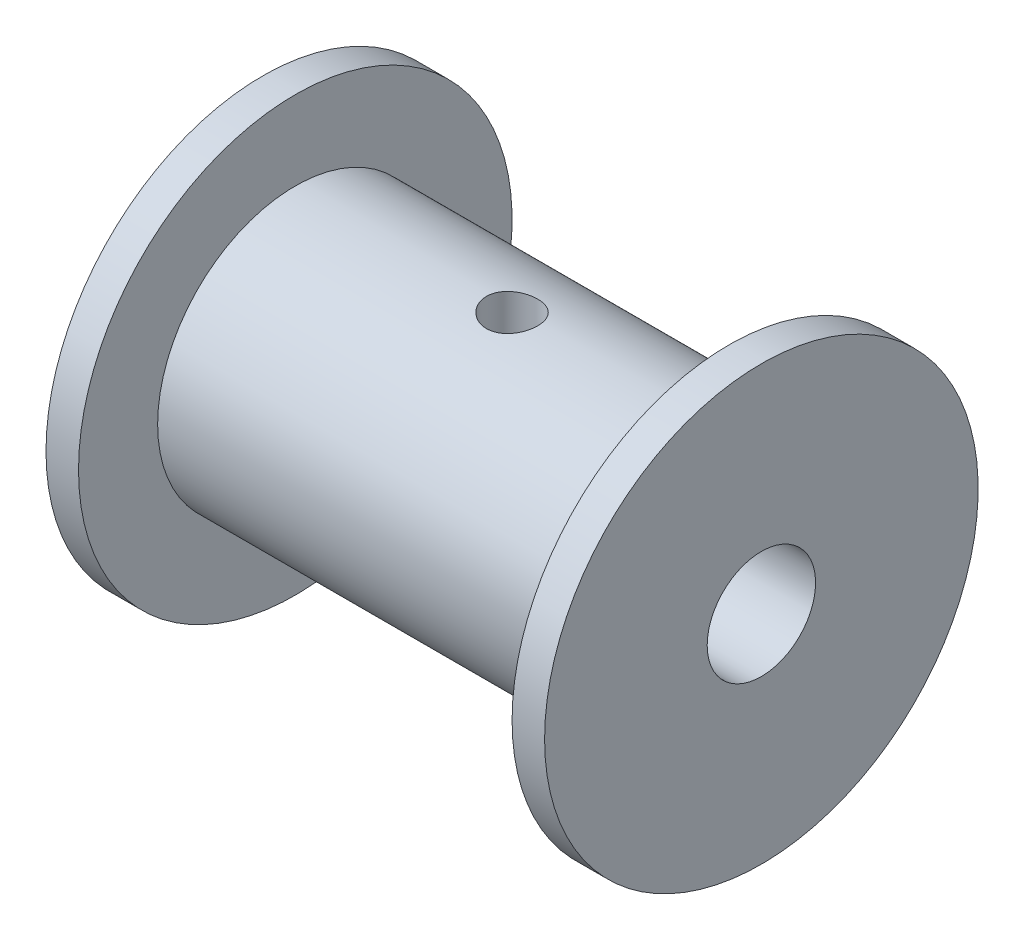
ISO-10303-21;
HEADER;
FILE_DESCRIPTION(('STEP AP214'),'2;1');
FILE_NAME('part.step','',(''),(''),'','','');
FILE_SCHEMA(('AUTOMOTIVE_DESIGN { 1 0 10303 214 1 1 1 1 }'));
ENDSEC;
DATA;
#1=APPLICATION_CONTEXT('core data for automotive mechanical design processes');
#2=APPLICATION_PROTOCOL_DEFINITION('international standard','automotive_design',2000,#1);
#3=PRODUCT_CONTEXT('',#1,'mechanical');
#4=PRODUCT('Part','Part','',(#3));
#5=PRODUCT_RELATED_PRODUCT_CATEGORY('part','',(#4));
#6=PRODUCT_DEFINITION_FORMATION('','',#4);
#7=PRODUCT_DEFINITION_CONTEXT('part definition',#1,'design');
#8=PRODUCT_DEFINITION('design','',#6,#7);
#9=PRODUCT_DEFINITION_SHAPE('','',#8);
#10=(LENGTH_UNIT() NAMED_UNIT(*) SI_UNIT(.MILLI.,.METRE.));
#11=(NAMED_UNIT(*) PLANE_ANGLE_UNIT() SI_UNIT($,.RADIAN.));
#12=(NAMED_UNIT(*) SI_UNIT($,.STERADIAN.) SOLID_ANGLE_UNIT());
#13=UNCERTAINTY_MEASURE_WITH_UNIT(LENGTH_MEASURE(1.E-05),#10,'distance_accuracy_value','');
#14=(GEOMETRIC_REPRESENTATION_CONTEXT(3) GLOBAL_UNCERTAINTY_ASSIGNED_CONTEXT((#13)) GLOBAL_UNIT_ASSIGNED_CONTEXT((#10,
#11,#12)) REPRESENTATION_CONTEXT('',''));
#15=CARTESIAN_POINT('',(0.,0.,0.));
#16=DIRECTION('',(0.,0.,1.));
#17=DIRECTION('',(1.,0.,0.));
#18=AXIS2_PLACEMENT_3D('',#15,#16,#17);
#19=CARTESIAN_POINT('',(-15.2755244755245,0.,0.));
#20=DIRECTION('',(-1.,0.,0.));
#21=DIRECTION('',(0.,0.,1.));
#22=AXIS2_PLACEMENT_3D('',#19,#20,#21);
#23=CYLINDRICAL_SURFACE('',#22,3.175);
#24=CARTESIAN_POINT('',(14.605,0.,0.));
#25=DIRECTION('',(-1.,0.,0.));
#26=DIRECTION('',(0.,0.,1.));
#27=AXIS2_PLACEMENT_3D('',#24,#25,#26);
#28=CIRCLE('',#27,3.175);
#29=CARTESIAN_POINT('',(14.605,0.,3.175));
#30=VERTEX_POINT('',#29);
#31=EDGE_CURVE('E76',#30,#30,#28,.T.);
#32=ORIENTED_EDGE('',*,*,#31,.F.);
#33=EDGE_LOOP('',(#32));
#34=FACE_BOUND('',#33,.T.);
#35=CARTESIAN_POINT('',(-14.605,0.,0.));
#36=DIRECTION('',(-1.,0.,0.));
#37=DIRECTION('',(0.,0.,1.));
#38=AXIS2_PLACEMENT_3D('',#35,#36,#37);
#39=CIRCLE('',#38,3.175);
#40=CARTESIAN_POINT('',(-14.605,0.,3.175));
#41=VERTEX_POINT('',#40);
#42=EDGE_CURVE('E70',#41,#41,#39,.T.);
#43=ORIENTED_EDGE('',*,*,#42,.T.);
#44=EDGE_LOOP('',(#43));
#45=FACE_BOUND('',#44,.T.);
#46=CARTESIAN_POINT('',(0.,2.7983253920872,-1.5));
#47=CARTESIAN_POINT('',(0.0788107476010317,2.79833097649977,-1.49999523547047));
#48=CARTESIAN_POINT('',(0.157735612205732,2.80170427159323,-1.49374832449328));
#49=CARTESIAN_POINT('',(0.313214667514685,2.81472644561665,-1.4690554061353));
#50=CARTESIAN_POINT('',(0.389762907162894,2.82438992585351,-1.45058101361493));
#51=CARTESIAN_POINT('',(0.537952673756733,2.84863009396432,-1.40237253355636));
#52=CARTESIAN_POINT('',(0.609616136431819,2.86318279906116,-1.37269332197988));
#53=CARTESIAN_POINT('',(0.74692939284759,2.89552502377023,-1.30308399064543));
#54=CARTESIAN_POINT('',(0.8125794422789,2.91331440566267,-1.26315430701281));
#55=CARTESIAN_POINT('',(0.941323245258398,2.95172227722859,-1.1707430871524));
#56=CARTESIAN_POINT('',(1.00387788849068,2.97245254188493,-1.11755658650795));
#57=CARTESIAN_POINT('',(1.11959143684936,3.01349951044786,-1.00161259672222));
#58=CARTESIAN_POINT('',(1.17274606260041,3.03381602228766,-0.938850772491945));
#59=CARTESIAN_POINT('',(1.27118937954777,3.07317288716969,-0.801034900704515));
#60=CARTESIAN_POINT('',(1.31583450125175,3.09206866660246,-0.725476017233364));
#61=CARTESIAN_POINT('',(1.39153752206176,3.12503381595021,-0.566861686619154));
#62=CARTESIAN_POINT('',(1.42260309774527,3.13910591174128,-0.483810507023549));
#63=CARTESIAN_POINT('',(1.46819431985617,3.16003750546179,-0.318263833167133));
#64=CARTESIAN_POINT('',(1.4836598006004,3.16730464125021,-0.23607983759682));
#65=CARTESIAN_POINT('',(1.50068669846295,3.17531500926786,-0.0699854874354078));
#66=CARTESIAN_POINT('',(1.50225551712034,3.17606171435844,0.0139239243031286));
#67=CARTESIAN_POINT('',(1.49185310738046,3.1711569999128,0.17410404695592));
#68=CARTESIAN_POINT('',(1.4809263684281,3.16599910390162,0.250460926307549));
#69=CARTESIAN_POINT('',(1.44768451199486,3.15058713309443,0.400106757592313));
#70=CARTESIAN_POINT('',(1.42536854800002,3.14033267949386,0.473395481043944));
#71=CARTESIAN_POINT('',(1.36978180811971,3.11549383971164,0.61616215999247));
#72=CARTESIAN_POINT('',(1.33635400002596,3.10084769916082,0.685567785451937));
#73=CARTESIAN_POINT('',(1.25968096352203,3.06858481389696,0.817962218284119));
#74=CARTESIAN_POINT('',(1.21643213988174,3.05096698193041,0.880948663490016));
#75=CARTESIAN_POINT('',(1.11701776567009,3.01265189942243,1.00453666893054));
#76=CARTESIAN_POINT('',(1.06005736803148,2.9918200943109,1.0644578414785));
#77=CARTESIAN_POINT('',(0.93699705964444,2.95046283361779,1.17424124933889));
#78=CARTESIAN_POINT('',(0.87089145595116,2.92993757775203,1.2240971710571));
#79=CARTESIAN_POINT('',(0.727172138151077,2.89039711066438,1.31484174230845));
#80=CARTESIAN_POINT('',(0.649138941996297,2.87151577260243,1.35512986365461));
#81=CARTESIAN_POINT('',(0.486283743531031,2.83914834140001,1.42170562946273));
#82=CARTESIAN_POINT('',(0.401468219875632,2.82565717160027,1.44800645544408));
#83=CARTESIAN_POINT('',(0.234253704737598,2.80697974613979,1.48387059914899));
#84=CARTESIAN_POINT('',(0.152157558069844,2.80124227464673,1.4945499135996));
#85=CARTESIAN_POINT('',(-0.0128364544628812,2.79714234532468,1.50221328025957));
#86=CARTESIAN_POINT('',(-0.0957338532268694,2.79877582206013,1.49920488189903));
#87=CARTESIAN_POINT('',(-0.25184110118071,2.80865284380239,1.4806017347564));
#88=CARTESIAN_POINT('',(-0.32523813353968,2.81627144126264,1.46619608896935));
#89=CARTESIAN_POINT('',(-0.468463633051388,2.83637948512089,1.42690562153975));
#90=CARTESIAN_POINT('',(-0.538291075738513,2.8488703210638,1.40201781025962));
#91=CARTESIAN_POINT('',(-0.676035807524976,2.87800314814948,1.3412324594274));
#92=CARTESIAN_POINT('',(-0.743715994140066,2.89481019393091,1.30487958898417));
#93=CARTESIAN_POINT('',(-0.872389828600745,2.93050507850425,1.22260967416881));
#94=CARTESIAN_POINT('',(-0.93338011780599,2.94939395301752,1.17668785898318));
#95=CARTESIAN_POINT('',(-1.05395122429284,2.98962533435876,1.07066250220429));
#96=CARTESIAN_POINT('',(-1.11263900919066,3.0110091844446,1.00955462247668));
#97=CARTESIAN_POINT('',(-1.2191662131219,3.05197816465585,0.877952835832725));
#98=CARTESIAN_POINT('',(-1.26700313884629,3.07156288076261,0.807456777596013));
#99=CARTESIAN_POINT('',(-1.35106340432696,3.10717258491727,0.657374049291596));
#100=CARTESIAN_POINT('',(-1.38708244177874,3.12313361565429,0.577656753882327));
#101=CARTESIAN_POINT('',(-1.44486593502356,3.14922093597641,0.412327293299583));
#102=CARTESIAN_POINT('',(-1.46664154231209,3.15935178938716,0.326719797872878));
#103=CARTESIAN_POINT('',(-1.49363889435459,3.17197971044583,0.159896332874223));
#104=CARTESIAN_POINT('',(-1.50011013632642,3.17505233840112,0.078925398284078));
#105=CARTESIAN_POINT('',(-1.49988711965684,3.17494636529876,-0.0829833461657175));
#106=CARTESIAN_POINT('',(-1.49319653511093,3.17176950877122,-0.163921158963004));
#107=CARTESIAN_POINT('',(-1.46770848023088,3.15985410378094,-0.318841842835547));
#108=CARTESIAN_POINT('',(-1.44959197491994,3.15142868675494,-0.392963167600614));
#109=CARTESIAN_POINT('',(-1.40262108547478,3.13010132928976,-0.537026434022491));
#110=CARTESIAN_POINT('',(-1.37376499240882,3.1171986764347,-0.60696770847403));
#111=CARTESIAN_POINT('',(-1.30473490189286,3.08738510301285,-0.744198443618439));
#112=CARTESIAN_POINT('',(-1.26410939390821,3.0703197298679,-0.811226286131094));
#113=CARTESIAN_POINT('',(-1.17328432091972,3.03405477724481,-0.937805412907553));
#114=CARTESIAN_POINT('',(-1.12308040855481,3.01485423033003,-0.997353281796323));
#115=CARTESIAN_POINT('',(-1.00928446778082,2.97425749382228,-1.11287613406119));
#116=CARTESIAN_POINT('',(-0.944896373173603,2.9528185885393,-1.16805442942683));
#117=CARTESIAN_POINT('',(-0.807312145748489,2.91171333700677,-1.26705651381277));
#118=CARTESIAN_POINT('',(-0.734109598744511,2.89204830000693,-1.31087196019013));
#119=CARTESIAN_POINT('',(-0.579232422210802,2.85663554941127,-1.3863737982034));
#120=CARTESIAN_POINT('',(-0.497439352525226,2.84095675906997,-1.41785130272302));
#121=CARTESIAN_POINT('',(-0.328811998329219,2.81635628214136,-1.4661232120466));
#122=CARTESIAN_POINT('',(-0.241995696672077,2.80741192483264,-1.48296690968124));
#123=CARTESIAN_POINT('',(-0.128694633247988,2.80116429672363,-1.49469268672873));
#124=CARTESIAN_POINT('',(-0.10301180774758,2.80010260103933,-1.49668048940514));
#125=CARTESIAN_POINT('',(-0.0515567295081782,2.79868221732461,-1.49933495903092));
#126=CARTESIAN_POINT('',(-0.0257844722890938,2.79832356503778,-1.50000155880871));
#127=CARTESIAN_POINT('',(0.,2.7983253920872,-1.5));
#128=B_SPLINE_CURVE_WITH_KNOTS('',3,(#46,#47,#48,#49,#50,#51,#52,#53,#54,#55,#56,#57,#58,#59,
#60,#61,#62,#63,#64,#65,#66,#67,#68,#69,#70,#71,#72,#73,#74,#75,#76,#77,#78,#79,#80,#81,#82,#83,
#84,#85,#86,#87,#88,#89,#90,#91,#92,#93,#94,#95,#96,#97,#98,#99,#100,#101,#102,#103,#104,#105,
#106,#107,#108,#109,#110,#111,#112,#113,#114,#115,#116,#117,#118,#119,#120,#121,#122,#123,#124,
#125,#126,#127),.UNSPECIFIED.,.T.,.F.,(4,2,2,2,2,2,2,2,2,2,2,2,2,2,2,2,2,2,2,2,2,2,2,2,2,2,2,2,
2,2,2,2,2,2,2,2,2,2,2,2,4),(0.,0.236323871838544,0.473198284289302,0.708927337380699,
0.944646362603916,1.19762429635865,1.45071710395354,1.71864285343498,1.98641694681215,
2.23687152724756,2.48719270436037,2.71802817018661,2.94888079555674,3.1831453100556,
3.41749572162706,3.67216706074964,3.92699765369087,4.19506898546716,4.46288723920479,
4.71043828617548,4.95785281342715,5.18239796950746,5.40700721193729,5.64198832122139,
5.87708686716682,6.13804637958085,6.39906579463174,6.66438519401193,6.92949661955738,
7.17207877892644,7.41459323161728,7.64386670961211,7.87317668624822,8.11282240294707,
8.35257714778319,8.61378861881715,8.87519133270404,9.14084608292566,9.40560248746477,
9.48291651801969,9.56023447921351),.UNSPECIFIED.);
#129=CARTESIAN_POINT('',(0.,2.7983253920872,-1.5));
#130=VERTEX_POINT('',#129);
#131=EDGE_CURVE('E96',#130,#130,#128,.T.);
#132=ORIENTED_EDGE('',*,*,#131,.F.);
#133=EDGE_LOOP('',(#132));
#134=FACE_BOUND('',#133,.T.);
#135=ADVANCED_FACE('F51',(#34,#45,#134),#23,.F.);
#136=CARTESIAN_POINT('',(-15.2755244755245,0.,0.));
#137=DIRECTION('',(-1.,0.,0.));
#138=DIRECTION('',(0.,0.,1.));
#139=AXIS2_PLACEMENT_3D('',#136,#137,#138);
#140=CYLINDRICAL_SURFACE('',#139,8.0645);
#141=CARTESIAN_POINT('',(-12.7,0.,0.));
#142=DIRECTION('',(-1.,0.,0.));
#143=DIRECTION('',(0.,0.,1.));
#144=AXIS2_PLACEMENT_3D('',#141,#142,#143);
#145=CIRCLE('',#144,8.0645);
#146=CARTESIAN_POINT('',(-12.7,0.,8.0645));
#147=VERTEX_POINT('',#146);
#148=EDGE_CURVE('E92',#147,#147,#145,.T.);
#149=ORIENTED_EDGE('',*,*,#148,.F.);
#150=EDGE_LOOP('',(#149));
#151=FACE_BOUND('',#150,.T.);
#152=CARTESIAN_POINT('',(12.7,0.,0.));
#153=DIRECTION('',(-1.,0.,0.));
#154=DIRECTION('',(0.,0.,1.));
#155=AXIS2_PLACEMENT_3D('',#152,#153,#154);
#156=CIRCLE('',#155,8.0645);
#157=CARTESIAN_POINT('',(12.7,0.,8.0645));
#158=VERTEX_POINT('',#157);
#159=EDGE_CURVE('E88',#158,#158,#156,.T.);
#160=ORIENTED_EDGE('',*,*,#159,.T.);
#161=EDGE_LOOP('',(#160));
#162=FACE_BOUND('',#161,.T.);
#163=CARTESIAN_POINT('',(0.,7.92377184489811,-1.5));
#164=CARTESIAN_POINT('',(0.08346999225124,7.9237734538727,-1.49999678574282));
#165=CARTESIAN_POINT('',(0.166981831122598,7.92510509008183,-1.49300912525413));
#166=CARTESIAN_POINT('',(0.331651557475362,7.93028125737973,-1.465261443805));
#167=CARTESIAN_POINT('',(0.412807373113565,7.93412793417546,-1.44448966269515));
#168=CARTESIAN_POINT('',(0.570358559424111,7.94388378807498,-1.38983296497414));
#169=CARTESIAN_POINT('',(0.646758254354492,7.94979105843547,-1.35596016807497));
#170=CARTESIAN_POINT('',(0.792785415471453,7.96300024226805,-1.27609492678907));
#171=CARTESIAN_POINT('',(0.862413427047705,7.97030204328437,-1.23010345954554));
#172=CARTESIAN_POINT('',(0.993779031686728,7.9855774618328,-1.12670590430802));
#173=CARTESIAN_POINT('',(1.05542163619568,7.99355757328761,-1.06918007561075));
#174=CARTESIAN_POINT('',(1.16823920190923,8.00923307476703,-0.944605532926529));
#175=CARTESIAN_POINT('',(1.21941348113181,8.0169284462149,-0.877556198991764));
#176=CARTESIAN_POINT('',(1.31020518495352,8.03123691251547,-0.735214641520338));
#177=CARTESIAN_POINT('',(1.34973313564861,8.03784146530635,-0.659864415440112));
#178=CARTESIAN_POINT('',(1.4155337793492,8.04915148284183,-0.503449338053651));
#179=CARTESIAN_POINT('',(1.44180754476066,8.05385710122446,-0.422384949689611));
#180=CARTESIAN_POINT('',(1.48006051144278,8.06079318837119,-0.257826787619601));
#181=CARTESIAN_POINT('',(1.49219980479087,8.06305135714503,-0.17437141552242));
#182=CARTESIAN_POINT('',(1.50233798434993,8.06493356258085,-0.00658004096476443));
#183=CARTESIAN_POINT('',(1.50033805628244,8.06455782012384,0.0777558870596309));
#184=CARTESIAN_POINT('',(1.48237749981114,8.06123620703969,0.243816740076963));
#185=CARTESIAN_POINT('',(1.46658924418254,8.05832207093516,0.325561034707383));
#186=CARTESIAN_POINT('',(1.42177273443912,8.0502866809281,0.485219503116541));
#187=CARTESIAN_POINT('',(1.39274400350547,8.04516534753988,0.563133538847228));
#188=CARTESIAN_POINT('',(1.32210579017994,8.03323788244329,0.713420735826199));
#189=CARTESIAN_POINT('',(1.28042724204538,8.02642253969638,0.785760673814137));
#190=CARTESIAN_POINT('',(1.18572336277713,8.01186102833994,0.922484388999932));
#191=CARTESIAN_POINT('',(1.13269689542425,8.0041147665555,0.986867368482127));
#192=CARTESIAN_POINT('',(1.01585206439317,7.98841171039542,1.10687065677505));
#193=CARTESIAN_POINT('',(0.951882907557722,7.98045350301508,1.16234405539621));
#194=CARTESIAN_POINT('',(0.815471301144276,7.9653353424318,1.26179684417697));
#195=CARTESIAN_POINT('',(0.743028731474736,7.95817540054528,1.305776071404));
#196=CARTESIAN_POINT('',(0.591533745322313,7.94546248569133,1.38103300471357));
#197=CARTESIAN_POINT('',(0.512470622228837,7.93991218309828,1.41228963841603));
#198=CARTESIAN_POINT('',(0.350088670254136,7.93108808617898,1.4610344761526));
#199=CARTESIAN_POINT('',(0.266770316402928,7.92781403833817,1.47852421348346));
#200=CARTESIAN_POINT('',(0.0995669829767135,7.92396322573631,1.49902487149708));
#201=CARTESIAN_POINT('',(0.0157087450574842,7.92334716793076,1.50224673307501));
#202=CARTESIAN_POINT('',(-0.151347559590066,7.92477697685847,1.49468538361545));
#203=CARTESIAN_POINT('',(-0.234545658220193,7.92682271416013,1.483902853551));
#204=CARTESIAN_POINT('',(-0.397228289082271,7.93330903129933,1.44881979239892));
#205=CARTESIAN_POINT('',(-0.47673746609808,7.93773005454083,1.42462960075962));
#206=CARTESIAN_POINT('',(-0.630574117098847,7.94845198992675,1.36353485958083));
#207=CARTESIAN_POINT('',(-0.704901214021849,7.95475303869108,1.326629386002));
#208=CARTESIAN_POINT('',(-0.847193844268481,7.96861467250661,1.24066526318392));
#209=CARTESIAN_POINT('',(-0.91507744549458,7.97618876284377,1.19147321412237));
#210=CARTESIAN_POINT('',(-1.04170287148394,7.99170496834265,1.08251244794541));
#211=CARTESIAN_POINT('',(-1.10044388710728,7.99964711599767,1.02274279568696));
#212=CARTESIAN_POINT('',(-1.20790342225976,8.0151306730024,0.893381906591112));
#213=CARTESIAN_POINT('',(-1.25648016441083,8.02266544854635,0.82367197704104));
#214=CARTESIAN_POINT('',(-1.34123220332478,8.03637407902485,0.676958042179703));
#215=CARTESIAN_POINT('',(-1.37740797217621,8.04254798576267,0.59995431467609));
#216=CARTESIAN_POINT('',(-1.43611829159826,8.05281069508312,0.441232587109995));
#217=CARTESIAN_POINT('',(-1.45872281202498,8.05691017535419,0.359541189147433));
#218=CARTESIAN_POINT('',(-1.4898724387586,8.06260765100307,0.193438057656404));
#219=CARTESIAN_POINT('',(-1.49841899979037,8.0642059052082,0.109026606522252));
#220=CARTESIAN_POINT('',(-1.50116011764579,8.06471581480838,-0.0587601988743187));
#221=CARTESIAN_POINT('',(-1.49556892499499,8.06366757682714,-0.142132006832127));
#222=CARTESIAN_POINT('',(-1.47066205121671,8.05908551327764,-0.306726317994638));
#223=CARTESIAN_POINT('',(-1.4513464971752,8.0555517107254,-0.387948841094244));
#224=CARTESIAN_POINT('',(-1.39962888793001,8.04639542707254,-0.545828097106256));
#225=CARTESIAN_POINT('',(-1.36724929448123,8.04077653231502,-0.622492408935781));
#226=CARTESIAN_POINT('',(-1.29034827815016,8.02805870428464,-0.769331984483264));
#227=CARTESIAN_POINT('',(-1.24582605920632,8.02095967398239,-0.839506822352059));
#228=CARTESIAN_POINT('',(-1.14516445600538,8.00593885136061,-0.972443982416024));
#229=CARTESIAN_POINT('',(-1.08887011890436,7.99800686931814,-1.03508783461836));
#230=CARTESIAN_POINT('',(-0.966584123846522,7.98227889621537,-1.15011418262556));
#231=CARTESIAN_POINT('',(-0.900590189522322,7.97448293755975,-1.20249426290747));
#232=CARTESIAN_POINT('',(-0.760061658823829,7.9598323995185,-1.29595246341368));
#233=CARTESIAN_POINT('',(-0.68545494399561,7.95298701211059,-1.33692362626079));
#234=CARTESIAN_POINT('',(-0.530314527576079,7.94112310521889,-1.40568546223609));
#235=CARTESIAN_POINT('',(-0.449786529692779,7.93610285467355,-1.43348863224149));
#236=CARTESIAN_POINT('',(-0.307512315550241,7.92950950462025,-1.46944509356762));
#237=CARTESIAN_POINT('',(-0.246601375268743,7.92737059720409,-1.480883642522));
#238=CARTESIAN_POINT('',(-0.123801280193672,7.92450118925832,-1.49616218729631));
#239=CARTESIAN_POINT('',(-0.0619121513189706,7.92377065147428,-1.50000238410921));
#240=CARTESIAN_POINT('',(0.,7.92377184489811,-1.5));
#241=B_SPLINE_CURVE_WITH_KNOTS('',3,(#163,#164,#165,#166,#167,#168,#169,#170,#171,#172,#173,
#174,#175,#176,#177,#178,#179,#180,#181,#182,#183,#184,#185,#186,#187,#188,#189,#190,#191,#192,
#193,#194,#195,#196,#197,#198,#199,#200,#201,#202,#203,#204,#205,#206,#207,#208,#209,#210,#211,
#212,#213,#214,#215,#216,#217,#218,#219,#220,#221,#222,#223,#224,#225,#226,#227,#228,#229,#230,
#231,#232,#233,#234,#235,#236,#237,#238,#239,#240),.UNSPECIFIED.,.T.,.F.,(4,2,2,2,2,2,2,2,2,2,2,
2,2,2,2,2,2,2,2,2,2,2,2,2,2,2,2,2,2,2,2,2,2,2,2,2,2,2,4),(0.,0.250183421207042,
0.500580565413789,0.750746619866986,1.00089250929468,1.25378386865681,1.50669169793819,
1.76149467250217,2.01627702746063,2.2681446572832,2.51999116562211,2.76873360564692,
3.01748500414491,3.26761974750813,3.51777954753311,3.77171474877918,4.02565354942093,
4.28001125295198,4.53434062322397,4.78489707662494,5.03544134700442,5.28395371670109,
5.53248414998902,5.78384013794753,6.03521835885676,6.28989837637596,6.54456869748887,
6.79791446964375,7.05123402379814,7.30073772756839,7.55023912099375,7.79931334807523,
8.0484039082057,8.30100669993306,8.55366886914115,8.808625562021,9.06333980498248,
9.24891312490274,9.43448153593896),.UNSPECIFIED.);
#242=CARTESIAN_POINT('',(0.,7.92377184489811,-1.5));
#243=VERTEX_POINT('',#242);
#244=EDGE_CURVE('E55',#243,#243,#241,.T.);
#245=ORIENTED_EDGE('',*,*,#244,.T.);
#246=EDGE_LOOP('',(#245));
#247=FACE_BOUND('',#246,.T.);
#248=ADVANCED_FACE('F111',(#151,#162,#247),#140,.T.);
#249=CARTESIAN_POINT('',(-12.7,0.,0.));
#250=DIRECTION('',(1.,0.,0.));
#251=DIRECTION('',(0.,0.,-1.));
#252=AXIS2_PLACEMENT_3D('',#249,#250,#251);
#253=PLANE('',#252);
#254=ORIENTED_EDGE('',*,*,#148,.T.);
#255=EDGE_LOOP('',(#254));
#256=FACE_BOUND('',#255,.T.);
#257=CARTESIAN_POINT('',(-12.7,0.,0.));
#258=DIRECTION('',(-1.,0.,0.));
#259=DIRECTION('',(0.,0.,1.));
#260=AXIS2_PLACEMENT_3D('',#257,#258,#259);
#261=CIRCLE('',#260,12.7);
#262=CARTESIAN_POINT('',(-12.7,0.,12.7));
#263=VERTEX_POINT('',#262);
#264=EDGE_CURVE('E10',#263,#263,#261,.T.);
#265=ORIENTED_EDGE('',*,*,#264,.F.);
#266=EDGE_LOOP('',(#265));
#267=FACE_BOUND('',#266,.T.);
#268=ADVANCED_FACE('F53',(#256,#267),#253,.T.);
#269=CARTESIAN_POINT('',(-15.2755244755245,0.,0.));
#270=DIRECTION('',(-1.,0.,0.));
#271=DIRECTION('',(0.,0.,1.));
#272=AXIS2_PLACEMENT_3D('',#269,#270,#271);
#273=CYLINDRICAL_SURFACE('',#272,12.7);
#274=ORIENTED_EDGE('',*,*,#264,.T.);
#275=EDGE_LOOP('',(#274));
#276=FACE_BOUND('',#275,.T.);
#277=CARTESIAN_POINT('',(-14.605,0.,0.));
#278=DIRECTION('',(-1.,0.,0.));
#279=DIRECTION('',(0.,0.,1.));
#280=AXIS2_PLACEMENT_3D('',#277,#278,#279);
#281=CIRCLE('',#280,12.7);
#282=CARTESIAN_POINT('',(-14.605,0.,12.7));
#283=VERTEX_POINT('',#282);
#284=EDGE_CURVE('E65',#283,#283,#281,.T.);
#285=ORIENTED_EDGE('',*,*,#284,.F.);
#286=EDGE_LOOP('',(#285));
#287=FACE_BOUND('',#286,.T.);
#288=ADVANCED_FACE('F130',(#276,#287),#273,.T.);
#289=CARTESIAN_POINT('',(-14.605,0.,0.));
#290=DIRECTION('',(1.,0.,0.));
#291=DIRECTION('',(0.,0.,-1.));
#292=AXIS2_PLACEMENT_3D('',#289,#290,#291);
#293=PLANE('',#292);
#294=ORIENTED_EDGE('',*,*,#42,.F.);
#295=EDGE_LOOP('',(#294));
#296=FACE_BOUND('',#295,.T.);
#297=ORIENTED_EDGE('',*,*,#284,.T.);
#298=EDGE_LOOP('',(#297));
#299=FACE_BOUND('',#298,.T.);
#300=ADVANCED_FACE('F125',(#296,#299),#293,.F.);
#301=CARTESIAN_POINT('',(14.605,0.,0.));
#302=DIRECTION('',(1.,0.,0.));
#303=DIRECTION('',(0.,0.,-1.));
#304=AXIS2_PLACEMENT_3D('',#301,#302,#303);
#305=PLANE('',#304);
#306=ORIENTED_EDGE('',*,*,#31,.T.);
#307=EDGE_LOOP('',(#306));
#308=FACE_BOUND('',#307,.T.);
#309=CARTESIAN_POINT('',(14.605,0.,0.));
#310=DIRECTION('',(-1.,0.,0.));
#311=DIRECTION('',(0.,0.,1.));
#312=AXIS2_PLACEMENT_3D('',#309,#310,#311);
#313=CIRCLE('',#312,12.7);
#314=CARTESIAN_POINT('',(14.605,0.,12.7));
#315=VERTEX_POINT('',#314);
#316=EDGE_CURVE('E80',#315,#315,#313,.T.);
#317=ORIENTED_EDGE('',*,*,#316,.F.);
#318=EDGE_LOOP('',(#317));
#319=FACE_BOUND('',#318,.T.);
#320=ADVANCED_FACE('F122',(#308,#319),#305,.T.);
#321=CARTESIAN_POINT('',(-15.2755244755245,0.,0.));
#322=DIRECTION('',(-1.,0.,0.));
#323=DIRECTION('',(0.,0.,1.));
#324=AXIS2_PLACEMENT_3D('',#321,#322,#323);
#325=CYLINDRICAL_SURFACE('',#324,12.7);
#326=CARTESIAN_POINT('',(12.7,0.,0.));
#327=DIRECTION('',(-1.,0.,0.));
#328=DIRECTION('',(0.,0.,1.));
#329=AXIS2_PLACEMENT_3D('',#326,#327,#328);
#330=CIRCLE('',#329,12.7);
#331=CARTESIAN_POINT('',(12.7,0.,12.7));
#332=VERTEX_POINT('',#331);
#333=EDGE_CURVE('E84',#332,#332,#330,.T.);
#334=ORIENTED_EDGE('',*,*,#333,.F.);
#335=EDGE_LOOP('',(#334));
#336=FACE_BOUND('',#335,.T.);
#337=ORIENTED_EDGE('',*,*,#316,.T.);
#338=EDGE_LOOP('',(#337));
#339=FACE_BOUND('',#338,.T.);
#340=ADVANCED_FACE('F119',(#336,#339),#325,.T.);
#341=CARTESIAN_POINT('',(12.7,0.,0.));
#342=DIRECTION('',(1.,0.,0.));
#343=DIRECTION('',(0.,0.,-1.));
#344=AXIS2_PLACEMENT_3D('',#341,#342,#343);
#345=PLANE('',#344);
#346=ORIENTED_EDGE('',*,*,#159,.F.);
#347=EDGE_LOOP('',(#346));
#348=FACE_BOUND('',#347,.T.);
#349=ORIENTED_EDGE('',*,*,#333,.T.);
#350=EDGE_LOOP('',(#349));
#351=FACE_BOUND('',#350,.T.);
#352=ADVANCED_FACE('F109',(#348,#351),#345,.F.);
#353=CARTESIAN_POINT('',(0.,12.7,0.));
#354=DIRECTION('',(0.,-1.,0.));
#355=DIRECTION('',(0.,0.,-1.));
#356=AXIS2_PLACEMENT_3D('',#353,#354,#355);
#357=CYLINDRICAL_SURFACE('',#356,1.5);
#358=ORIENTED_EDGE('',*,*,#244,.F.);
#359=EDGE_LOOP('',(#358));
#360=FACE_BOUND('',#359,.T.);
#361=ORIENTED_EDGE('',*,*,#131,.T.);
#362=EDGE_LOOP('',(#361));
#363=FACE_BOUND('',#362,.T.);
#364=ADVANCED_FACE('F106',(#360,#363),#357,.F.);
#365=CLOSED_SHELL('',(#135,#248,#268,#288,#300,#320,#340,#352,#364));
#366=MANIFOLD_SOLID_BREP('B2',#365);
#367=ADVANCED_BREP_SHAPE_REPRESENTATION('',(#18,#366),#14);
#368=SHAPE_DEFINITION_REPRESENTATION(#9,#367);
ENDSEC;
END-ISO-10303-21;
